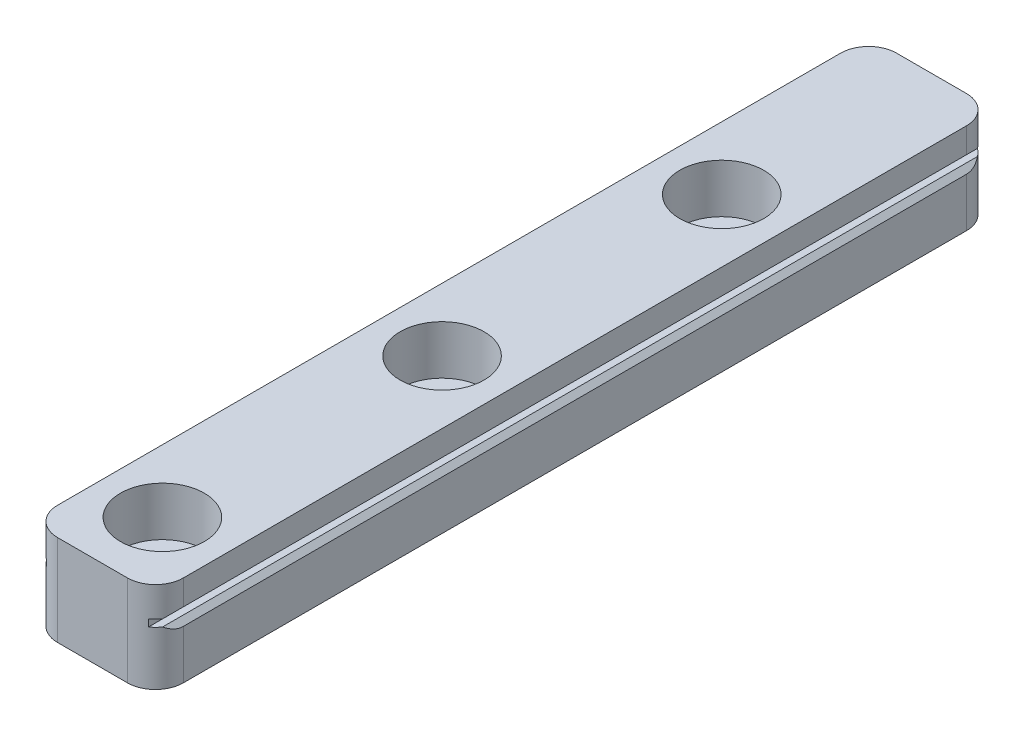
ISO-10303-21;
HEADER;
FILE_DESCRIPTION(('STEP AP214'),'2;1');
FILE_NAME('part.step','',(''),(''),'','','');
FILE_SCHEMA(('AUTOMOTIVE_DESIGN { 1 0 10303 214 1 1 1 1 }'));
ENDSEC;
DATA;
#1=APPLICATION_CONTEXT('core data for automotive mechanical design processes');
#2=APPLICATION_PROTOCOL_DEFINITION('international standard','automotive_design',2000,#1);
#3=PRODUCT_CONTEXT('',#1,'mechanical');
#4=PRODUCT('Part','Part','',(#3));
#5=PRODUCT_RELATED_PRODUCT_CATEGORY('part','',(#4));
#6=PRODUCT_DEFINITION_FORMATION('','',#4);
#7=PRODUCT_DEFINITION_CONTEXT('part definition',#1,'design');
#8=PRODUCT_DEFINITION('design','',#6,#7);
#9=PRODUCT_DEFINITION_SHAPE('','',#8);
#10=(LENGTH_UNIT() NAMED_UNIT(*) SI_UNIT(.MILLI.,.METRE.));
#11=(NAMED_UNIT(*) PLANE_ANGLE_UNIT() SI_UNIT($,.RADIAN.));
#12=(NAMED_UNIT(*) SI_UNIT($,.STERADIAN.) SOLID_ANGLE_UNIT());
#13=UNCERTAINTY_MEASURE_WITH_UNIT(LENGTH_MEASURE(1.E-05),#10,'distance_accuracy_value','');
#14=(GEOMETRIC_REPRESENTATION_CONTEXT(3) GLOBAL_UNCERTAINTY_ASSIGNED_CONTEXT((#13)) GLOBAL_UNIT_ASSIGNED_CONTEXT((#10,
#11,#12)) REPRESENTATION_CONTEXT('',''));
#15=CARTESIAN_POINT('',(0.,0.,0.));
#16=DIRECTION('',(0.,0.,1.));
#17=DIRECTION('',(1.,0.,0.));
#18=AXIS2_PLACEMENT_3D('',#15,#16,#17);
#19=CARTESIAN_POINT('',(0.,0.,-60.));
#20=DIRECTION('',(-1.,0.,0.));
#21=DIRECTION('',(0.,-1.,0.));
#22=AXIS2_PLACEMENT_3D('',#19,#20,#21);
#23=PLANE('',#22);
#24=DIRECTION('',(0.,0.,1.));
#25=VECTOR('',#24,1.);
#26=CARTESIAN_POINT('',(0.,3.5,-60.));
#27=LINE('',#26,#25);
#28=CARTESIAN_POINT('',(0.,3.5,-58.));
#29=VERTEX_POINT('',#28);
#30=CARTESIAN_POINT('',(0.,3.5,-2.));
#31=VERTEX_POINT('',#30);
#32=EDGE_CURVE('E204',#29,#31,#27,.T.);
#33=ORIENTED_EDGE('',*,*,#32,.F.);
#34=DIRECTION('',(0.,-1.,0.));
#35=VECTOR('',#34,1.);
#36=CARTESIAN_POINT('',(0.,0.,-58.));
#37=LINE('',#36,#35);
#38=CARTESIAN_POINT('',(0.,0.,-58.));
#39=VERTEX_POINT('',#38);
#40=EDGE_CURVE('E248',#29,#39,#37,.T.);
#41=ORIENTED_EDGE('',*,*,#40,.T.);
#42=DIRECTION('',(0.,0.,1.));
#43=VECTOR('',#42,1.);
#44=CARTESIAN_POINT('',(0.,0.,-60.));
#45=LINE('',#44,#43);
#46=CARTESIAN_POINT('',(0.,0.,-2.));
#47=VERTEX_POINT('',#46);
#48=EDGE_CURVE('E196',#39,#47,#45,.T.);
#49=ORIENTED_EDGE('',*,*,#48,.T.);
#50=DIRECTION('',(0.,-1.,0.));
#51=VECTOR('',#50,1.);
#52=CARTESIAN_POINT('',(0.,3.5,-2.));
#53=LINE('',#52,#51);
#54=EDGE_CURVE('E184',#47,#31,#53,.F.);
#55=ORIENTED_EDGE('',*,*,#54,.T.);
#56=EDGE_LOOP('',(#33,#41,#49,#55));
#57=FACE_BOUND('',#56,.T.);
#58=ADVANCED_FACE('F34',(#57),#23,.T.);
#59=CARTESIAN_POINT('',(0.,3.5,-60.));
#60=DIRECTION('',(-0.707106781186545,0.70710678118655,0.));
#61=DIRECTION('',(-0.70710678118655,-0.707106781186545,0.));
#62=AXIS2_PLACEMENT_3D('',#59,#60,#61);
#63=PLANE('',#62);
#64=DIRECTION('',(0.,0.,1.));
#65=VECTOR('',#64,1.);
#66=CARTESIAN_POINT('',(0.353553390593273,3.85355339059327,-60.));
#67=LINE('',#66,#65);
#68=CARTESIAN_POINT('',(0.353553390593273,3.85355339059327,-59.1354354065173));
#69=VERTEX_POINT('',#68);
#70=CARTESIAN_POINT('',(0.353553390593273,3.85355339059327,-0.864564593482705));
#71=VERTEX_POINT('',#70);
#72=EDGE_CURVE('E295',#69,#71,#67,.T.);
#73=ORIENTED_EDGE('',*,*,#72,.F.);
#74=CARTESIAN_POINT('',(2.,5.49999999999999,-58.));
#75=DIRECTION('',(-0.707106781186545,0.70710678118655,0.));
#76=DIRECTION('',(-0.70710678118655,-0.707106781186545,0.));
#77=AXIS2_PLACEMENT_3D('',#74,#75,#76);
#78=ELLIPSE('',#77,2.82842712474618,2.);
#79=EDGE_CURVE('E271',#69,#29,#78,.T.);
#80=ORIENTED_EDGE('',*,*,#79,.T.);
#81=ORIENTED_EDGE('',*,*,#32,.T.);
#82=CARTESIAN_POINT('',(2.,5.49999999999999,-2.));
#83=DIRECTION('',(-0.707106781186545,0.70710678118655,0.));
#84=DIRECTION('',(0.70710678118655,0.707106781186545,0.));
#85=AXIS2_PLACEMENT_3D('',#82,#83,#84);
#86=ELLIPSE('',#85,2.82842712474618,2.);
#87=EDGE_CURVE('E49',#31,#71,#86,.T.);
#88=ORIENTED_EDGE('',*,*,#87,.T.);
#89=EDGE_LOOP('',(#73,#80,#81,#88));
#90=FACE_BOUND('',#89,.T.);
#91=ADVANCED_FACE('F293',(#90),#63,.T.);
#92=CARTESIAN_POINT('',(0.353553390593273,3.85355339059327,-60.));
#93=DIRECTION('',(0.,1.,0.));
#94=DIRECTION('',(0.,0.,1.));
#95=AXIS2_PLACEMENT_3D('',#92,#93,#94);
#96=PLANE('',#95);
#97=DIRECTION('',(0.,0.,1.));
#98=VECTOR('',#97,1.);
#99=CARTESIAN_POINT('',(0.853553390593273,3.85355339059327,-60.));
#100=LINE('',#99,#98);
#101=CARTESIAN_POINT('',(0.853553390593273,3.85355339059327,-59.6387983926584));
#102=VERTEX_POINT('',#101);
#103=CARTESIAN_POINT('',(0.853553390593273,3.85355339059327,-0.361201607341578));
#104=VERTEX_POINT('',#103);
#105=EDGE_CURVE('E297',#102,#104,#100,.T.);
#106=ORIENTED_EDGE('',*,*,#105,.F.);
#107=CARTESIAN_POINT('',(2.,3.85355339059327,-58.));
#108=DIRECTION('',(0.,1.,0.));
#109=DIRECTION('',(0.,0.,1.));
#110=AXIS2_PLACEMENT_3D('',#107,#108,#109);
#111=CIRCLE('',#110,2.);
#112=EDGE_CURVE('E56',#102,#69,#111,.T.);
#113=ORIENTED_EDGE('',*,*,#112,.T.);
#114=ORIENTED_EDGE('',*,*,#72,.T.);
#115=CARTESIAN_POINT('',(2.,3.85355339059327,-2.));
#116=DIRECTION('',(0.,1.,0.));
#117=DIRECTION('',(0.,0.,1.));
#118=AXIS2_PLACEMENT_3D('',#115,#116,#117);
#119=CIRCLE('',#118,2.);
#120=EDGE_CURVE('E267',#71,#104,#119,.T.);
#121=ORIENTED_EDGE('',*,*,#120,.T.);
#122=EDGE_LOOP('',(#106,#113,#114,#121));
#123=FACE_BOUND('',#122,.T.);
#124=ADVANCED_FACE('F433',(#123),#96,.T.);
#125=CARTESIAN_POINT('',(0.853553390593273,3.85355339059327,-60.));
#126=DIRECTION('',(-1.,0.,0.));
#127=DIRECTION('',(0.,0.,1.));
#128=AXIS2_PLACEMENT_3D('',#125,#126,#127);
#129=PLANE('',#128);
#130=DIRECTION('',(0.,0.,1.));
#131=VECTOR('',#130,1.);
#132=CARTESIAN_POINT('',(0.853553390593273,4.35355339059327,-60.));
#133=LINE('',#132,#131);
#134=CARTESIAN_POINT('',(0.853553390593273,4.35355339059327,-59.6387983926584));
#135=VERTEX_POINT('',#134);
#136=CARTESIAN_POINT('',(0.853553390593273,4.35355339059327,-0.36120160734158));
#137=VERTEX_POINT('',#136);
#138=EDGE_CURVE('E303',#135,#137,#133,.T.);
#139=ORIENTED_EDGE('',*,*,#138,.F.);
#140=DIRECTION('',(0.,-1.,0.));
#141=VECTOR('',#140,1.);
#142=CARTESIAN_POINT('',(0.853553390593273,4.35355339059327,-59.6387983926584));
#143=LINE('',#142,#141);
#144=EDGE_CURVE('E265',#135,#102,#143,.T.);
#145=ORIENTED_EDGE('',*,*,#144,.T.);
#146=ORIENTED_EDGE('',*,*,#105,.T.);
#147=DIRECTION('',(0.,1.,0.));
#148=VECTOR('',#147,1.);
#149=CARTESIAN_POINT('',(0.853553390593273,3.85355339059327,-0.361201607341581));
#150=LINE('',#149,#148);
#151=EDGE_CURVE('E263',#104,#137,#150,.T.);
#152=ORIENTED_EDGE('',*,*,#151,.T.);
#153=EDGE_LOOP('',(#139,#145,#146,#152));
#154=FACE_BOUND('',#153,.T.);
#155=ADVANCED_FACE('F432',(#154),#129,.T.);
#156=CARTESIAN_POINT('',(0.853553390593273,4.35355339059327,-60.));
#157=DIRECTION('',(0.,-1.,0.));
#158=DIRECTION('',(0.,0.,-1.));
#159=AXIS2_PLACEMENT_3D('',#156,#157,#158);
#160=PLANE('',#159);
#161=DIRECTION('',(0.,0.,1.));
#162=VECTOR('',#161,1.);
#163=CARTESIAN_POINT('',(0.353553390593274,4.35355339059327,-60.));
#164=LINE('',#163,#162);
#165=CARTESIAN_POINT('',(0.353553390593274,4.35355339059327,-59.1354354065173));
#166=VERTEX_POINT('',#165);
#167=CARTESIAN_POINT('',(0.353553390593274,4.35355339059327,-0.86456459348272));
#168=VERTEX_POINT('',#167);
#169=EDGE_CURVE('E306',#166,#168,#164,.T.);
#170=ORIENTED_EDGE('',*,*,#169,.F.);
#171=CARTESIAN_POINT('',(2.,4.35355339059327,-58.));
#172=DIRECTION('',(0.,-1.,0.));
#173=DIRECTION('',(0.,0.,-1.));
#174=AXIS2_PLACEMENT_3D('',#171,#172,#173);
#175=CIRCLE('',#174,2.);
#176=EDGE_CURVE('E261',#166,#135,#175,.T.);
#177=ORIENTED_EDGE('',*,*,#176,.T.);
#178=ORIENTED_EDGE('',*,*,#138,.T.);
#179=CARTESIAN_POINT('',(2.,4.35355339059327,-2.));
#180=DIRECTION('',(0.,-1.,0.));
#181=DIRECTION('',(0.,0.,-1.));
#182=AXIS2_PLACEMENT_3D('',#179,#180,#181);
#183=CIRCLE('',#182,2.);
#184=EDGE_CURVE('E259',#137,#168,#183,.T.);
#185=ORIENTED_EDGE('',*,*,#184,.T.);
#186=EDGE_LOOP('',(#170,#177,#178,#185));
#187=FACE_BOUND('',#186,.T.);
#188=ADVANCED_FACE('F428',(#187),#160,.T.);
#189=CARTESIAN_POINT('',(0.353553390593274,4.35355339059327,-60.));
#190=DIRECTION('',(-0.707106781186547,-0.707106781186547,0.));
#191=DIRECTION('',(0.707106781186548,-0.707106781186548,0.));
#192=AXIS2_PLACEMENT_3D('',#189,#190,#191);
#193=PLANE('',#192);
#194=DIRECTION('',(0.,0.,1.));
#195=VECTOR('',#194,1.);
#196=CARTESIAN_POINT('',(0.,4.70710678118655,-60.));
#197=LINE('',#196,#195);
#198=CARTESIAN_POINT('',(0.,4.70710678118655,-58.));
#199=VERTEX_POINT('',#198);
#200=CARTESIAN_POINT('',(0.,4.70710678118655,-2.));
#201=VERTEX_POINT('',#200);
#202=EDGE_CURVE('E309',#199,#201,#197,.T.);
#203=ORIENTED_EDGE('',*,*,#202,.F.);
#204=CARTESIAN_POINT('',(2.,2.70710678118655,-58.));
#205=DIRECTION('',(-0.707106781186547,-0.707106781186547,0.));
#206=DIRECTION('',(0.707106781186548,-0.707106781186548,0.));
#207=AXIS2_PLACEMENT_3D('',#204,#205,#206);
#208=ELLIPSE('',#207,2.82842712474619,2.);
#209=EDGE_CURVE('E257',#199,#166,#208,.T.);
#210=ORIENTED_EDGE('',*,*,#209,.T.);
#211=ORIENTED_EDGE('',*,*,#169,.T.);
#212=CARTESIAN_POINT('',(2.,2.70710678118655,-2.));
#213=DIRECTION('',(-0.707106781186547,-0.707106781186547,0.));
#214=DIRECTION('',(-0.707106781186548,0.707106781186548,0.));
#215=AXIS2_PLACEMENT_3D('',#212,#213,#214);
#216=ELLIPSE('',#215,2.82842712474619,2.);
#217=EDGE_CURVE('E255',#168,#201,#216,.T.);
#218=ORIENTED_EDGE('',*,*,#217,.T.);
#219=EDGE_LOOP('',(#203,#210,#211,#218));
#220=FACE_BOUND('',#219,.T.);
#221=ADVANCED_FACE('F424',(#220),#193,.T.);
#222=CARTESIAN_POINT('',(0.,4.70710678118655,-60.));
#223=DIRECTION('',(-1.,0.,0.));
#224=DIRECTION('',(0.,0.,1.));
#225=AXIS2_PLACEMENT_3D('',#222,#223,#224);
#226=PLANE('',#225);
#227=DIRECTION('',(0.,0.,1.));
#228=VECTOR('',#227,1.);
#229=CARTESIAN_POINT('',(0.,6.5,-60.));
#230=LINE('',#229,#228);
#231=CARTESIAN_POINT('',(0.,6.5,-58.));
#232=VERTEX_POINT('',#231);
#233=CARTESIAN_POINT('',(0.,6.5,-2.));
#234=VERTEX_POINT('',#233);
#235=EDGE_CURVE('E312',#232,#234,#230,.T.);
#236=ORIENTED_EDGE('',*,*,#235,.F.);
#237=DIRECTION('',(0.,-1.,0.));
#238=VECTOR('',#237,1.);
#239=CARTESIAN_POINT('',(0.,5.60355339059327,-58.));
#240=LINE('',#239,#238);
#241=EDGE_CURVE('E253',#232,#199,#240,.T.);
#242=ORIENTED_EDGE('',*,*,#241,.T.);
#243=ORIENTED_EDGE('',*,*,#202,.T.);
#244=DIRECTION('',(0.,-1.,0.));
#245=VECTOR('',#244,1.);
#246=CARTESIAN_POINT('',(0.,6.5,-2.));
#247=LINE('',#246,#245);
#248=EDGE_CURVE('E251',#201,#234,#247,.F.);
#249=ORIENTED_EDGE('',*,*,#248,.T.);
#250=EDGE_LOOP('',(#236,#242,#243,#249));
#251=FACE_BOUND('',#250,.T.);
#252=ADVANCED_FACE('F398',(#251),#226,.T.);
#253=CARTESIAN_POINT('',(9.,6.5,-60.));
#254=DIRECTION('',(0.,1.,0.));
#255=DIRECTION('',(0.,0.,1.));
#256=AXIS2_PLACEMENT_3D('',#253,#254,#255);
#257=PLANE('',#256);
#258=CARTESIAN_POINT('',(4.5,6.5,-25.));
#259=DIRECTION('',(0.,1.,0.));
#260=DIRECTION('',(0.,0.,1.));
#261=AXIS2_PLACEMENT_3D('',#258,#259,#260);
#262=CIRCLE('',#261,3.);
#263=CARTESIAN_POINT('',(4.5,6.5,-22.));
#264=VERTEX_POINT('',#263);
#265=EDGE_CURVE('E353',#264,#264,#262,.T.);
#266=ORIENTED_EDGE('',*,*,#265,.F.);
#267=EDGE_LOOP('',(#266));
#268=FACE_BOUND('',#267,.T.);
#269=CARTESIAN_POINT('',(4.5,6.5,-45.));
#270=DIRECTION('',(0.,1.,0.));
#271=DIRECTION('',(0.,0.,1.));
#272=AXIS2_PLACEMENT_3D('',#269,#270,#271);
#273=CIRCLE('',#272,3.);
#274=CARTESIAN_POINT('',(4.5,6.5,-42.));
#275=VERTEX_POINT('',#274);
#276=EDGE_CURVE('E347',#275,#275,#273,.T.);
#277=ORIENTED_EDGE('',*,*,#276,.F.);
#278=EDGE_LOOP('',(#277));
#279=FACE_BOUND('',#278,.T.);
#280=CARTESIAN_POINT('',(4.5,6.5,-5.));
#281=DIRECTION('',(0.,1.,0.));
#282=DIRECTION('',(0.,0.,1.));
#283=AXIS2_PLACEMENT_3D('',#280,#281,#282);
#284=CIRCLE('',#283,3.);
#285=CARTESIAN_POINT('',(4.5,6.5,-2.));
#286=VERTEX_POINT('',#285);
#287=EDGE_CURVE('E341',#286,#286,#284,.T.);
#288=ORIENTED_EDGE('',*,*,#287,.F.);
#289=EDGE_LOOP('',(#288));
#290=FACE_BOUND('',#289,.T.);
#291=DIRECTION('',(0.,0.,1.));
#292=VECTOR('',#291,1.);
#293=CARTESIAN_POINT('',(9.,6.5,-60.));
#294=LINE('',#293,#292);
#295=CARTESIAN_POINT('',(9.,6.5,-58.));
#296=VERTEX_POINT('',#295);
#297=CARTESIAN_POINT('',(9.,6.5,-2.));
#298=VERTEX_POINT('',#297);
#299=EDGE_CURVE('E315',#296,#298,#294,.T.);
#300=ORIENTED_EDGE('',*,*,#299,.F.);
#301=CARTESIAN_POINT('',(7.,6.5,-58.));
#302=DIRECTION('',(0.,1.,0.));
#303=DIRECTION('',(0.,0.,1.));
#304=AXIS2_PLACEMENT_3D('',#301,#302,#303);
#305=CIRCLE('',#304,2.);
#306=CARTESIAN_POINT('',(7.,6.5,-60.));
#307=VERTEX_POINT('',#306);
#308=EDGE_CURVE('E236',#296,#307,#305,.T.);
#309=ORIENTED_EDGE('',*,*,#308,.T.);
#310=DIRECTION('',(-1.,0.,0.));
#311=VECTOR('',#310,1.);
#312=CARTESIAN_POINT('',(9.,6.5,-60.));
#313=LINE('',#312,#311);
#314=CARTESIAN_POINT('',(2.,6.5,-60.));
#315=VERTEX_POINT('',#314);
#316=EDGE_CURVE('E333',#307,#315,#313,.T.);
#317=ORIENTED_EDGE('',*,*,#316,.T.);
#318=CARTESIAN_POINT('',(2.,6.5,-58.));
#319=DIRECTION('',(0.,1.,0.));
#320=DIRECTION('',(0.,0.,1.));
#321=AXIS2_PLACEMENT_3D('',#318,#319,#320);
#322=CIRCLE('',#321,2.);
#323=EDGE_CURVE('E234',#315,#232,#322,.T.);
#324=ORIENTED_EDGE('',*,*,#323,.T.);
#325=ORIENTED_EDGE('',*,*,#235,.T.);
#326=CARTESIAN_POINT('',(2.,6.5,-2.));
#327=DIRECTION('',(0.,1.,0.));
#328=DIRECTION('',(0.,0.,1.));
#329=AXIS2_PLACEMENT_3D('',#326,#327,#328);
#330=CIRCLE('',#329,2.);
#331=CARTESIAN_POINT('',(2.,6.5,0.));
#332=VERTEX_POINT('',#331);
#333=EDGE_CURVE('E229',#234,#332,#330,.T.);
#334=ORIENTED_EDGE('',*,*,#333,.T.);
#335=DIRECTION('',(-1.,0.,0.));
#336=VECTOR('',#335,1.);
#337=CARTESIAN_POINT('',(9.,6.5,0.));
#338=LINE('',#337,#336);
#339=CARTESIAN_POINT('',(7.,6.5,0.));
#340=VERTEX_POINT('',#339);
#341=EDGE_CURVE('E280',#340,#332,#338,.T.);
#342=ORIENTED_EDGE('',*,*,#341,.F.);
#343=CARTESIAN_POINT('',(7.,6.5,-2.));
#344=DIRECTION('',(0.,1.,0.));
#345=DIRECTION('',(0.,0.,1.));
#346=AXIS2_PLACEMENT_3D('',#343,#344,#345);
#347=CIRCLE('',#346,2.);
#348=EDGE_CURVE('E232',#340,#298,#347,.T.);
#349=ORIENTED_EDGE('',*,*,#348,.T.);
#350=EDGE_LOOP('',(#300,#309,#317,#324,#325,#334,#342,#349));
#351=FACE_BOUND('',#350,.T.);
#352=ADVANCED_FACE('F394',(#268,#279,#290,#351),#257,.T.);
#353=CARTESIAN_POINT('',(9.,4.70710678118655,-60.));
#354=DIRECTION('',(1.,0.,0.));
#355=DIRECTION('',(0.,1.,0.));
#356=AXIS2_PLACEMENT_3D('',#353,#354,#355);
#357=PLANE('',#356);
#358=DIRECTION('',(0.,0.,1.));
#359=VECTOR('',#358,1.);
#360=CARTESIAN_POINT('',(9.,4.70710678118655,-60.));
#361=LINE('',#360,#359);
#362=CARTESIAN_POINT('',(9.,4.70710678118655,-58.));
#363=VERTEX_POINT('',#362);
#364=CARTESIAN_POINT('',(9.,4.70710678118655,-2.));
#365=VERTEX_POINT('',#364);
#366=EDGE_CURVE('E318',#363,#365,#361,.T.);
#367=ORIENTED_EDGE('',*,*,#366,.F.);
#368=DIRECTION('',(0.,1.,0.));
#369=VECTOR('',#368,1.);
#370=CARTESIAN_POINT('',(9.,5.60355339059327,-58.));
#371=LINE('',#370,#369);
#372=EDGE_CURVE('E227',#363,#296,#371,.T.);
#373=ORIENTED_EDGE('',*,*,#372,.T.);
#374=ORIENTED_EDGE('',*,*,#299,.T.);
#375=DIRECTION('',(0.,-1.,0.));
#376=VECTOR('',#375,1.);
#377=CARTESIAN_POINT('',(9.,5.60355339059327,-2.));
#378=LINE('',#377,#376);
#379=EDGE_CURVE('E225',#298,#365,#378,.T.);
#380=ORIENTED_EDGE('',*,*,#379,.T.);
#381=EDGE_LOOP('',(#367,#373,#374,#380));
#382=FACE_BOUND('',#381,.T.);
#383=ADVANCED_FACE('F397',(#382),#357,.T.);
#384=CARTESIAN_POINT('',(8.64644660940673,4.35355339059327,-60.));
#385=DIRECTION('',(0.707106781186547,-0.707106781186547,0.));
#386=DIRECTION('',(0.707106781186548,0.707106781186548,0.));
#387=AXIS2_PLACEMENT_3D('',#384,#385,#386);
#388=PLANE('',#387);
#389=DIRECTION('',(0.,0.,1.));
#390=VECTOR('',#389,1.);
#391=CARTESIAN_POINT('',(8.64644660940673,4.35355339059327,-60.));
#392=LINE('',#391,#390);
#393=CARTESIAN_POINT('',(8.64644660940673,4.35355339059327,-59.1354354065173));
#394=VERTEX_POINT('',#393);
#395=CARTESIAN_POINT('',(8.64644660940673,4.35355339059327,-0.864564593482702));
#396=VERTEX_POINT('',#395);
#397=EDGE_CURVE('E321',#394,#396,#392,.T.);
#398=ORIENTED_EDGE('',*,*,#397,.F.);
#399=CARTESIAN_POINT('',(7.,2.70710678118655,-58.));
#400=DIRECTION('',(0.707106781186547,-0.707106781186547,0.));
#401=DIRECTION('',(0.707106781186548,0.707106781186548,0.));
#402=AXIS2_PLACEMENT_3D('',#399,#400,#401);
#403=ELLIPSE('',#402,2.82842712474619,2.);
#404=EDGE_CURVE('E223',#394,#363,#403,.T.);
#405=ORIENTED_EDGE('',*,*,#404,.T.);
#406=ORIENTED_EDGE('',*,*,#366,.T.);
#407=CARTESIAN_POINT('',(7.,2.70710678118655,-2.));
#408=DIRECTION('',(0.707106781186547,-0.707106781186547,0.));
#409=DIRECTION('',(-0.707106781186548,-0.707106781186548,0.));
#410=AXIS2_PLACEMENT_3D('',#407,#408,#409);
#411=ELLIPSE('',#410,2.82842712474619,2.);
#412=EDGE_CURVE('E221',#365,#396,#411,.T.);
#413=ORIENTED_EDGE('',*,*,#412,.T.);
#414=EDGE_LOOP('',(#398,#405,#406,#413));
#415=FACE_BOUND('',#414,.T.);
#416=ADVANCED_FACE('F464',(#415),#388,.T.);
#417=CARTESIAN_POINT('',(8.14644660940673,4.35355339059327,-60.));
#418=DIRECTION('',(0.,-1.,0.));
#419=DIRECTION('',(0.,0.,-1.));
#420=AXIS2_PLACEMENT_3D('',#417,#418,#419);
#421=PLANE('',#420);
#422=DIRECTION('',(0.,0.,1.));
#423=VECTOR('',#422,1.);
#424=CARTESIAN_POINT('',(8.14644660940673,4.35355339059327,-60.));
#425=LINE('',#424,#423);
#426=CARTESIAN_POINT('',(8.14644660940673,4.35355339059327,-59.6387983926584));
#427=VERTEX_POINT('',#426);
#428=CARTESIAN_POINT('',(8.14644660940673,4.35355339059327,-0.361201607341578));
#429=VERTEX_POINT('',#428);
#430=EDGE_CURVE('E324',#427,#429,#425,.T.);
#431=ORIENTED_EDGE('',*,*,#430,.F.);
#432=CARTESIAN_POINT('',(7.,4.35355339059327,-58.));
#433=DIRECTION('',(0.,-1.,0.));
#434=DIRECTION('',(0.,0.,-1.));
#435=AXIS2_PLACEMENT_3D('',#432,#433,#434);
#436=CIRCLE('',#435,2.);
#437=EDGE_CURVE('E219',#427,#394,#436,.T.);
#438=ORIENTED_EDGE('',*,*,#437,.T.);
#439=ORIENTED_EDGE('',*,*,#397,.T.);
#440=CARTESIAN_POINT('',(7.,4.35355339059327,-2.));
#441=DIRECTION('',(0.,-1.,0.));
#442=DIRECTION('',(0.,0.,-1.));
#443=AXIS2_PLACEMENT_3D('',#440,#441,#442);
#444=CIRCLE('',#443,2.);
#445=EDGE_CURVE('E217',#396,#429,#444,.T.);
#446=ORIENTED_EDGE('',*,*,#445,.T.);
#447=EDGE_LOOP('',(#431,#438,#439,#446));
#448=FACE_BOUND('',#447,.T.);
#449=ADVANCED_FACE('F469',(#448),#421,.T.);
#450=CARTESIAN_POINT('',(8.14644660940673,3.85355339059327,-60.));
#451=DIRECTION('',(1.,0.,0.));
#452=DIRECTION('',(0.,0.,-1.));
#453=AXIS2_PLACEMENT_3D('',#450,#451,#452);
#454=PLANE('',#453);
#455=DIRECTION('',(0.,0.,1.));
#456=VECTOR('',#455,1.);
#457=CARTESIAN_POINT('',(8.14644660940673,3.85355339059327,-60.));
#458=LINE('',#457,#456);
#459=CARTESIAN_POINT('',(8.14644660940673,3.85355339059327,-59.6387983926584));
#460=VERTEX_POINT('',#459);
#461=CARTESIAN_POINT('',(8.14644660940673,3.85355339059327,-0.361201607341579));
#462=VERTEX_POINT('',#461);
#463=EDGE_CURVE('E327',#460,#462,#458,.T.);
#464=ORIENTED_EDGE('',*,*,#463,.F.);
#465=DIRECTION('',(0.,1.,0.));
#466=VECTOR('',#465,1.);
#467=CARTESIAN_POINT('',(8.14644660940673,3.85355339059327,-59.6387983926584));
#468=LINE('',#467,#466);
#469=EDGE_CURVE('E215',#460,#427,#468,.T.);
#470=ORIENTED_EDGE('',*,*,#469,.T.);
#471=ORIENTED_EDGE('',*,*,#430,.T.);
#472=DIRECTION('',(0.,-1.,0.));
#473=VECTOR('',#472,1.);
#474=CARTESIAN_POINT('',(8.14644660940673,4.35355339059327,-0.361201607341581));
#475=LINE('',#474,#473);
#476=EDGE_CURVE('E213',#429,#462,#475,.T.);
#477=ORIENTED_EDGE('',*,*,#476,.T.);
#478=EDGE_LOOP('',(#464,#470,#471,#477));
#479=FACE_BOUND('',#478,.T.);
#480=ADVANCED_FACE('F473',(#479),#454,.T.);
#481=CARTESIAN_POINT('',(8.64644660940673,3.85355339059327,-60.));
#482=DIRECTION('',(0.,1.,0.));
#483=DIRECTION('',(0.,0.,1.));
#484=AXIS2_PLACEMENT_3D('',#481,#482,#483);
#485=PLANE('',#484);
#486=DIRECTION('',(0.,0.,1.));
#487=VECTOR('',#486,1.);
#488=CARTESIAN_POINT('',(8.64644660940673,3.85355339059327,-60.));
#489=LINE('',#488,#487);
#490=CARTESIAN_POINT('',(8.64644660940673,3.85355339059327,-59.1354354065173));
#491=VERTEX_POINT('',#490);
#492=CARTESIAN_POINT('',(8.64644660940673,3.85355339059327,-0.864564593482706));
#493=VERTEX_POINT('',#492);
#494=EDGE_CURVE('E330',#491,#493,#489,.T.);
#495=ORIENTED_EDGE('',*,*,#494,.F.);
#496=CARTESIAN_POINT('',(7.,3.85355339059327,-58.));
#497=DIRECTION('',(0.,1.,0.));
#498=DIRECTION('',(0.,0.,1.));
#499=AXIS2_PLACEMENT_3D('',#496,#497,#498);
#500=CIRCLE('',#499,2.);
#501=EDGE_CURVE('E211',#491,#460,#500,.T.);
#502=ORIENTED_EDGE('',*,*,#501,.T.);
#503=ORIENTED_EDGE('',*,*,#463,.T.);
#504=CARTESIAN_POINT('',(7.,3.85355339059327,-2.));
#505=DIRECTION('',(0.,1.,0.));
#506=DIRECTION('',(0.,0.,1.));
#507=AXIS2_PLACEMENT_3D('',#504,#505,#506);
#508=CIRCLE('',#507,2.);
#509=EDGE_CURVE('E209',#462,#493,#508,.T.);
#510=ORIENTED_EDGE('',*,*,#509,.T.);
#511=EDGE_LOOP('',(#495,#502,#503,#510));
#512=FACE_BOUND('',#511,.T.);
#513=ADVANCED_FACE('F477',(#512),#485,.T.);
#514=CARTESIAN_POINT('',(9.,3.5,-60.));
#515=DIRECTION('',(0.707106781186545,0.70710678118655,0.));
#516=DIRECTION('',(-0.70710678118655,0.707106781186545,0.));
#517=AXIS2_PLACEMENT_3D('',#514,#515,#516);
#518=PLANE('',#517);
#519=DIRECTION('',(0.,0.,1.));
#520=VECTOR('',#519,1.);
#521=CARTESIAN_POINT('',(9.,3.5,-60.));
#522=LINE('',#521,#520);
#523=CARTESIAN_POINT('',(9.,3.5,-58.));
#524=VERTEX_POINT('',#523);
#525=CARTESIAN_POINT('',(9.,3.5,-2.));
#526=VERTEX_POINT('',#525);
#527=EDGE_CURVE('E195',#524,#526,#522,.T.);
#528=ORIENTED_EDGE('',*,*,#527,.F.);
#529=CARTESIAN_POINT('',(7.,5.49999999999999,-58.));
#530=DIRECTION('',(0.707106781186545,0.70710678118655,0.));
#531=DIRECTION('',(-0.70710678118655,0.707106781186545,0.));
#532=AXIS2_PLACEMENT_3D('',#529,#530,#531);
#533=ELLIPSE('',#532,2.82842712474618,2.);
#534=EDGE_CURVE('E200',#524,#491,#533,.T.);
#535=ORIENTED_EDGE('',*,*,#534,.T.);
#536=ORIENTED_EDGE('',*,*,#494,.T.);
#537=CARTESIAN_POINT('',(7.,5.49999999999999,-2.));
#538=DIRECTION('',(0.707106781186545,0.70710678118655,0.));
#539=DIRECTION('',(0.70710678118655,-0.707106781186545,0.));
#540=AXIS2_PLACEMENT_3D('',#537,#538,#539);
#541=ELLIPSE('',#540,2.82842712474618,2.);
#542=EDGE_CURVE('E201',#493,#526,#541,.T.);
#543=ORIENTED_EDGE('',*,*,#542,.T.);
#544=EDGE_LOOP('',(#528,#535,#536,#543));
#545=FACE_BOUND('',#544,.T.);
#546=ADVANCED_FACE('F479',(#545),#518,.T.);
#547=CARTESIAN_POINT('',(9.,0.,-60.));
#548=DIRECTION('',(1.,0.,0.));
#549=DIRECTION('',(0.,0.,-1.));
#550=AXIS2_PLACEMENT_3D('',#547,#548,#549);
#551=PLANE('',#550);
#552=DIRECTION('',(0.,0.,1.));
#553=VECTOR('',#552,1.);
#554=CARTESIAN_POINT('',(9.,0.,-60.));
#555=LINE('',#554,#553);
#556=CARTESIAN_POINT('',(9.,0.,-58.));
#557=VERTEX_POINT('',#556);
#558=CARTESIAN_POINT('',(9.,0.,-2.));
#559=VERTEX_POINT('',#558);
#560=EDGE_CURVE('E177',#557,#559,#555,.T.);
#561=ORIENTED_EDGE('',*,*,#560,.F.);
#562=DIRECTION('',(0.,1.,0.));
#563=VECTOR('',#562,1.);
#564=CARTESIAN_POINT('',(9.,0.,-58.));
#565=LINE('',#564,#563);
#566=EDGE_CURVE('E191',#557,#524,#565,.T.);
#567=ORIENTED_EDGE('',*,*,#566,.T.);
#568=ORIENTED_EDGE('',*,*,#527,.T.);
#569=DIRECTION('',(0.,1.,0.));
#570=VECTOR('',#569,1.);
#571=CARTESIAN_POINT('',(9.,0.,-2.));
#572=LINE('',#571,#570);
#573=EDGE_CURVE('E194',#526,#559,#572,.F.);
#574=ORIENTED_EDGE('',*,*,#573,.T.);
#575=EDGE_LOOP('',(#561,#567,#568,#574));
#576=FACE_BOUND('',#575,.T.);
#577=ADVANCED_FACE('F189',(#576),#551,.T.);
#578=CARTESIAN_POINT('',(0.,0.,-60.));
#579=DIRECTION('',(0.,-1.,0.));
#580=DIRECTION('',(0.,0.,-1.));
#581=AXIS2_PLACEMENT_3D('',#578,#579,#580);
#582=PLANE('',#581);
#583=CARTESIAN_POINT('',(4.5,0.,-25.));
#584=DIRECTION('',(0.,-1.,0.));
#585=DIRECTION('',(0.,0.,-1.));
#586=AXIS2_PLACEMENT_3D('',#583,#584,#585);
#587=CIRCLE('',#586,1.75);
#588=CARTESIAN_POINT('',(4.5,0.,-26.75));
#589=VERTEX_POINT('',#588);
#590=EDGE_CURVE('E370',#589,#589,#587,.F.);
#591=ORIENTED_EDGE('',*,*,#590,.T.);
#592=EDGE_LOOP('',(#591));
#593=FACE_BOUND('',#592,.T.);
#594=CARTESIAN_POINT('',(4.5,0.,-45.));
#595=DIRECTION('',(0.,-1.,0.));
#596=DIRECTION('',(0.,0.,-1.));
#597=AXIS2_PLACEMENT_3D('',#594,#595,#596);
#598=CIRCLE('',#597,1.75);
#599=CARTESIAN_POINT('',(4.5,0.,-46.75));
#600=VERTEX_POINT('',#599);
#601=EDGE_CURVE('E364',#600,#600,#598,.F.);
#602=ORIENTED_EDGE('',*,*,#601,.T.);
#603=EDGE_LOOP('',(#602));
#604=FACE_BOUND('',#603,.T.);
#605=CARTESIAN_POINT('',(4.5,0.,-5.));
#606=DIRECTION('',(0.,-1.,0.));
#607=DIRECTION('',(0.,0.,-1.));
#608=AXIS2_PLACEMENT_3D('',#605,#606,#607);
#609=CIRCLE('',#608,1.75);
#610=CARTESIAN_POINT('',(4.5,0.,-6.75));
#611=VERTEX_POINT('',#610);
#612=EDGE_CURVE('E356',#611,#611,#609,.F.);
#613=ORIENTED_EDGE('',*,*,#612,.T.);
#614=EDGE_LOOP('',(#613));
#615=FACE_BOUND('',#614,.T.);
#616=DIRECTION('',(1.,0.,0.));
#617=VECTOR('',#616,1.);
#618=CARTESIAN_POINT('',(0.,0.,-60.));
#619=LINE('',#618,#617);
#620=CARTESIAN_POINT('',(2.,0.,-60.));
#621=VERTEX_POINT('',#620);
#622=CARTESIAN_POINT('',(7.,0.,-60.));
#623=VERTEX_POINT('',#622);
#624=EDGE_CURVE('E180',#621,#623,#619,.T.);
#625=ORIENTED_EDGE('',*,*,#624,.T.);
#626=CARTESIAN_POINT('',(7.,0.,-58.));
#627=DIRECTION('',(0.,-1.,0.));
#628=DIRECTION('',(0.,0.,-1.));
#629=AXIS2_PLACEMENT_3D('',#626,#627,#628);
#630=CIRCLE('',#629,2.);
#631=EDGE_CURVE('E174',#623,#557,#630,.T.);
#632=ORIENTED_EDGE('',*,*,#631,.T.);
#633=ORIENTED_EDGE('',*,*,#560,.T.);
#634=CARTESIAN_POINT('',(7.,0.,-2.));
#635=DIRECTION('',(0.,-1.,0.));
#636=DIRECTION('',(0.,0.,-1.));
#637=AXIS2_PLACEMENT_3D('',#634,#635,#636);
#638=CIRCLE('',#637,2.);
#639=CARTESIAN_POINT('',(7.,0.,0.));
#640=VERTEX_POINT('',#639);
#641=EDGE_CURVE('E244',#559,#640,#638,.T.);
#642=ORIENTED_EDGE('',*,*,#641,.T.);
#643=DIRECTION('',(1.,0.,0.));
#644=VECTOR('',#643,1.);
#645=CARTESIAN_POINT('',(0.,0.,0.));
#646=LINE('',#645,#644);
#647=CARTESIAN_POINT('',(2.,0.,0.));
#648=VERTEX_POINT('',#647);
#649=EDGE_CURVE('E277',#648,#640,#646,.T.);
#650=ORIENTED_EDGE('',*,*,#649,.F.);
#651=CARTESIAN_POINT('',(2.,0.,-2.));
#652=DIRECTION('',(0.,-1.,0.));
#653=DIRECTION('',(0.,0.,-1.));
#654=AXIS2_PLACEMENT_3D('',#651,#652,#653);
#655=CIRCLE('',#654,2.);
#656=EDGE_CURVE('E242',#648,#47,#655,.T.);
#657=ORIENTED_EDGE('',*,*,#656,.T.);
#658=ORIENTED_EDGE('',*,*,#48,.F.);
#659=CARTESIAN_POINT('',(2.,0.,-58.));
#660=DIRECTION('',(0.,-1.,0.));
#661=DIRECTION('',(0.,0.,-1.));
#662=AXIS2_PLACEMENT_3D('',#659,#660,#661);
#663=CIRCLE('',#662,2.);
#664=EDGE_CURVE('E185',#39,#621,#663,.T.);
#665=ORIENTED_EDGE('',*,*,#664,.T.);
#666=EDGE_LOOP('',(#625,#632,#633,#642,#650,#657,#658,#665));
#667=FACE_BOUND('',#666,.T.);
#668=ADVANCED_FACE('F176',(#593,#604,#615,#667),#582,.T.);
#669=CARTESIAN_POINT('',(0.,0.,-60.));
#670=DIRECTION('',(0.,0.,-1.));
#671=DIRECTION('',(-1.,0.,0.));
#672=AXIS2_PLACEMENT_3D('',#669,#670,#671);
#673=PLANE('',#672);
#674=ORIENTED_EDGE('',*,*,#316,.F.);
#675=DIRECTION('',(0.,1.,0.));
#676=VECTOR('',#675,1.);
#677=CARTESIAN_POINT('',(7.,0.,-60.));
#678=LINE('',#677,#676);
#679=EDGE_CURVE('E240',#307,#623,#678,.F.);
#680=ORIENTED_EDGE('',*,*,#679,.T.);
#681=ORIENTED_EDGE('',*,*,#624,.F.);
#682=DIRECTION('',(0.,-1.,0.));
#683=VECTOR('',#682,1.);
#684=CARTESIAN_POINT('',(2.,0.,-60.));
#685=LINE('',#684,#683);
#686=EDGE_CURVE('E238',#621,#315,#685,.F.);
#687=ORIENTED_EDGE('',*,*,#686,.T.);
#688=EDGE_LOOP('',(#674,#680,#681,#687));
#689=FACE_BOUND('',#688,.T.);
#690=ADVANCED_FACE('F410',(#689),#673,.T.);
#691=CARTESIAN_POINT('',(0.,0.,0.));
#692=DIRECTION('',(0.,0.,-1.));
#693=DIRECTION('',(-1.,0.,0.));
#694=AXIS2_PLACEMENT_3D('',#691,#692,#693);
#695=PLANE('',#694);
#696=ORIENTED_EDGE('',*,*,#649,.T.);
#697=DIRECTION('',(0.,1.,0.));
#698=VECTOR('',#697,1.);
#699=CARTESIAN_POINT('',(7.,3.5,0.));
#700=LINE('',#699,#698);
#701=EDGE_CURVE('E11',#640,#340,#700,.T.);
#702=ORIENTED_EDGE('',*,*,#701,.T.);
#703=ORIENTED_EDGE('',*,*,#341,.T.);
#704=DIRECTION('',(0.,-1.,0.));
#705=VECTOR('',#704,1.);
#706=CARTESIAN_POINT('',(2.,0.,0.));
#707=LINE('',#706,#705);
#708=EDGE_CURVE('E42',#332,#648,#707,.T.);
#709=ORIENTED_EDGE('',*,*,#708,.T.);
#710=EDGE_LOOP('',(#696,#702,#703,#709));
#711=FACE_BOUND('',#710,.T.);
#712=ADVANCED_FACE('F276',(#711),#695,.F.);
#713=CARTESIAN_POINT('',(4.5,3.,-5.));
#714=DIRECTION('',(0.,1.,0.));
#715=DIRECTION('',(0.,0.,1.));
#716=AXIS2_PLACEMENT_3D('',#713,#714,#715);
#717=CYLINDRICAL_SURFACE('',#716,3.);
#718=CARTESIAN_POINT('',(4.5,3.,-5.));
#719=DIRECTION('',(0.,1.,0.));
#720=DIRECTION('',(0.,0.,1.));
#721=AXIS2_PLACEMENT_3D('',#718,#719,#720);
#722=CIRCLE('',#721,3.);
#723=CARTESIAN_POINT('',(4.5,3.,-2.));
#724=VERTEX_POINT('',#723);
#725=EDGE_CURVE('E286',#724,#724,#722,.T.);
#726=ORIENTED_EDGE('',*,*,#725,.F.);
#727=EDGE_LOOP('',(#726));
#728=FACE_BOUND('',#727,.T.);
#729=ORIENTED_EDGE('',*,*,#287,.T.);
#730=EDGE_LOOP('',(#729));
#731=FACE_BOUND('',#730,.T.);
#732=ADVANCED_FACE('F572',(#728,#731),#717,.F.);
#733=CARTESIAN_POINT('',(4.5,3.,-5.));
#734=DIRECTION('',(0.,1.,0.));
#735=DIRECTION('',(0.,0.,1.));
#736=AXIS2_PLACEMENT_3D('',#733,#734,#735);
#737=PLANE('',#736);
#738=CARTESIAN_POINT('',(4.5,3.,-5.));
#739=DIRECTION('',(0.,1.,0.));
#740=DIRECTION('',(0.,0.,1.));
#741=AXIS2_PLACEMENT_3D('',#738,#739,#740);
#742=CIRCLE('',#741,1.75);
#743=CARTESIAN_POINT('',(4.5,3.,-3.25));
#744=VERTEX_POINT('',#743);
#745=EDGE_CURVE('E361',#744,#744,#742,.T.);
#746=ORIENTED_EDGE('',*,*,#745,.F.);
#747=EDGE_LOOP('',(#746));
#748=FACE_BOUND('',#747,.T.);
#749=ORIENTED_EDGE('',*,*,#725,.T.);
#750=EDGE_LOOP('',(#749));
#751=FACE_BOUND('',#750,.T.);
#752=ADVANCED_FACE('F642',(#748,#751),#737,.T.);
#753=CARTESIAN_POINT('',(4.5,3.,-45.));
#754=DIRECTION('',(0.,1.,0.));
#755=DIRECTION('',(0.,0.,1.));
#756=AXIS2_PLACEMENT_3D('',#753,#754,#755);
#757=CYLINDRICAL_SURFACE('',#756,3.);
#758=CARTESIAN_POINT('',(4.5,3.,-45.));
#759=DIRECTION('',(0.,1.,0.));
#760=DIRECTION('',(0.,0.,1.));
#761=AXIS2_PLACEMENT_3D('',#758,#759,#760);
#762=CIRCLE('',#761,3.);
#763=CARTESIAN_POINT('',(4.5,3.,-42.));
#764=VERTEX_POINT('',#763);
#765=EDGE_CURVE('E344',#764,#764,#762,.T.);
#766=ORIENTED_EDGE('',*,*,#765,.F.);
#767=EDGE_LOOP('',(#766));
#768=FACE_BOUND('',#767,.T.);
#769=ORIENTED_EDGE('',*,*,#276,.T.);
#770=EDGE_LOOP('',(#769));
#771=FACE_BOUND('',#770,.T.);
#772=ADVANCED_FACE('F635',(#768,#771),#757,.F.);
#773=CARTESIAN_POINT('',(4.5,3.,-45.));
#774=DIRECTION('',(0.,1.,0.));
#775=DIRECTION('',(0.,0.,1.));
#776=AXIS2_PLACEMENT_3D('',#773,#774,#775);
#777=PLANE('',#776);
#778=CARTESIAN_POINT('',(4.5,3.,-45.));
#779=DIRECTION('',(0.,1.,0.));
#780=DIRECTION('',(0.,0.,1.));
#781=AXIS2_PLACEMENT_3D('',#778,#779,#780);
#782=CIRCLE('',#781,1.75);
#783=CARTESIAN_POINT('',(4.5,3.,-43.25));
#784=VERTEX_POINT('',#783);
#785=EDGE_CURVE('E367',#784,#784,#782,.T.);
#786=ORIENTED_EDGE('',*,*,#785,.F.);
#787=EDGE_LOOP('',(#786));
#788=FACE_BOUND('',#787,.T.);
#789=ORIENTED_EDGE('',*,*,#765,.T.);
#790=EDGE_LOOP('',(#789));
#791=FACE_BOUND('',#790,.T.);
#792=ADVANCED_FACE('F390',(#788,#791),#777,.T.);
#793=CARTESIAN_POINT('',(4.5,3.,-25.));
#794=DIRECTION('',(0.,1.,0.));
#795=DIRECTION('',(0.,0.,1.));
#796=AXIS2_PLACEMENT_3D('',#793,#794,#795);
#797=CYLINDRICAL_SURFACE('',#796,3.);
#798=CARTESIAN_POINT('',(4.5,3.,-25.));
#799=DIRECTION('',(0.,1.,0.));
#800=DIRECTION('',(0.,0.,1.));
#801=AXIS2_PLACEMENT_3D('',#798,#799,#800);
#802=CIRCLE('',#801,3.);
#803=CARTESIAN_POINT('',(4.5,3.,-22.));
#804=VERTEX_POINT('',#803);
#805=EDGE_CURVE('E350',#804,#804,#802,.T.);
#806=ORIENTED_EDGE('',*,*,#805,.F.);
#807=EDGE_LOOP('',(#806));
#808=FACE_BOUND('',#807,.T.);
#809=ORIENTED_EDGE('',*,*,#265,.T.);
#810=EDGE_LOOP('',(#809));
#811=FACE_BOUND('',#810,.T.);
#812=ADVANCED_FACE('F384',(#808,#811),#797,.F.);
#813=CARTESIAN_POINT('',(4.5,3.,-25.));
#814=DIRECTION('',(0.,1.,0.));
#815=DIRECTION('',(0.,0.,1.));
#816=AXIS2_PLACEMENT_3D('',#813,#814,#815);
#817=PLANE('',#816);
#818=CARTESIAN_POINT('',(4.5,3.,-25.));
#819=DIRECTION('',(0.,1.,0.));
#820=DIRECTION('',(0.,0.,1.));
#821=AXIS2_PLACEMENT_3D('',#818,#819,#820);
#822=CIRCLE('',#821,1.75);
#823=CARTESIAN_POINT('',(4.5,3.,-23.25));
#824=VERTEX_POINT('',#823);
#825=EDGE_CURVE('E373',#824,#824,#822,.T.);
#826=ORIENTED_EDGE('',*,*,#825,.F.);
#827=EDGE_LOOP('',(#826));
#828=FACE_BOUND('',#827,.T.);
#829=ORIENTED_EDGE('',*,*,#805,.T.);
#830=EDGE_LOOP('',(#829));
#831=FACE_BOUND('',#830,.T.);
#832=ADVANCED_FACE('F380',(#828,#831),#817,.T.);
#833=CARTESIAN_POINT('',(4.5,-4.94974746830584,-5.));
#834=DIRECTION('',(0.,1.,0.));
#835=DIRECTION('',(0.,0.,1.));
#836=AXIS2_PLACEMENT_3D('',#833,#834,#835);
#837=CYLINDRICAL_SURFACE('',#836,1.75);
#838=ORIENTED_EDGE('',*,*,#745,.T.);
#839=EDGE_LOOP('',(#838));
#840=FACE_BOUND('',#839,.T.);
#841=ORIENTED_EDGE('',*,*,#612,.F.);
#842=EDGE_LOOP('',(#841));
#843=FACE_BOUND('',#842,.T.);
#844=ADVANCED_FACE('F383',(#840,#843),#837,.F.);
#845=CARTESIAN_POINT('',(4.5,-4.94974746830584,-45.));
#846=DIRECTION('',(0.,1.,0.));
#847=DIRECTION('',(0.,0.,1.));
#848=AXIS2_PLACEMENT_3D('',#845,#846,#847);
#849=CYLINDRICAL_SURFACE('',#848,1.75);
#850=ORIENTED_EDGE('',*,*,#785,.T.);
#851=EDGE_LOOP('',(#850));
#852=FACE_BOUND('',#851,.T.);
#853=ORIENTED_EDGE('',*,*,#601,.F.);
#854=EDGE_LOOP('',(#853));
#855=FACE_BOUND('',#854,.T.);
#856=ADVANCED_FACE('F605',(#852,#855),#849,.F.);
#857=CARTESIAN_POINT('',(4.5,-4.94974746830584,-25.));
#858=DIRECTION('',(0.,1.,0.));
#859=DIRECTION('',(0.,0.,1.));
#860=AXIS2_PLACEMENT_3D('',#857,#858,#859);
#861=CYLINDRICAL_SURFACE('',#860,1.75);
#862=ORIENTED_EDGE('',*,*,#825,.T.);
#863=EDGE_LOOP('',(#862));
#864=FACE_BOUND('',#863,.T.);
#865=ORIENTED_EDGE('',*,*,#590,.F.);
#866=EDGE_LOOP('',(#865));
#867=FACE_BOUND('',#866,.T.);
#868=ADVANCED_FACE('F377',(#864,#867),#861,.F.);
#869=CARTESIAN_POINT('',(7.,0.,-58.));
#870=DIRECTION('',(0.,1.,0.));
#871=DIRECTION('',(0.,0.,1.));
#872=AXIS2_PLACEMENT_3D('',#869,#870,#871);
#873=CYLINDRICAL_SURFACE('',#872,2.);
#874=ORIENTED_EDGE('',*,*,#631,.F.);
#875=ORIENTED_EDGE('',*,*,#679,.F.);
#876=ORIENTED_EDGE('',*,*,#308,.F.);
#877=ORIENTED_EDGE('',*,*,#372,.F.);
#878=ORIENTED_EDGE('',*,*,#404,.F.);
#879=ORIENTED_EDGE('',*,*,#437,.F.);
#880=ORIENTED_EDGE('',*,*,#469,.F.);
#881=ORIENTED_EDGE('',*,*,#501,.F.);
#882=ORIENTED_EDGE('',*,*,#534,.F.);
#883=ORIENTED_EDGE('',*,*,#566,.F.);
#884=EDGE_LOOP('',(#874,#875,#876,#877,#878,#879,#880,#881,#882,#883));
#885=FACE_BOUND('',#884,.T.);
#886=ADVANCED_FACE('F198',(#885),#873,.T.);
#887=CARTESIAN_POINT('',(2.,0.,-58.));
#888=DIRECTION('',(0.,-1.,0.));
#889=DIRECTION('',(1.,0.,0.));
#890=AXIS2_PLACEMENT_3D('',#887,#888,#889);
#891=CYLINDRICAL_SURFACE('',#890,2.);
#892=ORIENTED_EDGE('',*,*,#323,.F.);
#893=ORIENTED_EDGE('',*,*,#686,.F.);
#894=ORIENTED_EDGE('',*,*,#664,.F.);
#895=ORIENTED_EDGE('',*,*,#40,.F.);
#896=ORIENTED_EDGE('',*,*,#79,.F.);
#897=ORIENTED_EDGE('',*,*,#112,.F.);
#898=ORIENTED_EDGE('',*,*,#144,.F.);
#899=ORIENTED_EDGE('',*,*,#176,.F.);
#900=ORIENTED_EDGE('',*,*,#209,.F.);
#901=ORIENTED_EDGE('',*,*,#241,.F.);
#902=EDGE_LOOP('',(#892,#893,#894,#895,#896,#897,#898,#899,#900,#901));
#903=FACE_BOUND('',#902,.T.);
#904=ADVANCED_FACE('F413',(#903),#891,.T.);
#905=CARTESIAN_POINT('',(7.,0.,-2.));
#906=DIRECTION('',(0.,-1.,0.));
#907=DIRECTION('',(0.,0.,-1.));
#908=AXIS2_PLACEMENT_3D('',#905,#906,#907);
#909=CYLINDRICAL_SURFACE('',#908,2.);
#910=ORIENTED_EDGE('',*,*,#641,.F.);
#911=ORIENTED_EDGE('',*,*,#573,.F.);
#912=ORIENTED_EDGE('',*,*,#542,.F.);
#913=ORIENTED_EDGE('',*,*,#509,.F.);
#914=ORIENTED_EDGE('',*,*,#476,.F.);
#915=ORIENTED_EDGE('',*,*,#445,.F.);
#916=ORIENTED_EDGE('',*,*,#412,.F.);
#917=ORIENTED_EDGE('',*,*,#379,.F.);
#918=ORIENTED_EDGE('',*,*,#348,.F.);
#919=ORIENTED_EDGE('',*,*,#701,.F.);
#920=EDGE_LOOP('',(#910,#911,#912,#913,#914,#915,#916,#917,#918,#919));
#921=FACE_BOUND('',#920,.T.);
#922=ADVANCED_FACE('F452',(#921),#909,.T.);
#923=CARTESIAN_POINT('',(2.,0.,-2.));
#924=DIRECTION('',(0.,1.,0.));
#925=DIRECTION('',(-1.,0.,0.));
#926=AXIS2_PLACEMENT_3D('',#923,#924,#925);
#927=CYLINDRICAL_SURFACE('',#926,2.);
#928=ORIENTED_EDGE('',*,*,#656,.F.);
#929=ORIENTED_EDGE('',*,*,#708,.F.);
#930=ORIENTED_EDGE('',*,*,#333,.F.);
#931=ORIENTED_EDGE('',*,*,#248,.F.);
#932=ORIENTED_EDGE('',*,*,#217,.F.);
#933=ORIENTED_EDGE('',*,*,#184,.F.);
#934=ORIENTED_EDGE('',*,*,#151,.F.);
#935=ORIENTED_EDGE('',*,*,#120,.F.);
#936=ORIENTED_EDGE('',*,*,#87,.F.);
#937=ORIENTED_EDGE('',*,*,#54,.F.);
#938=EDGE_LOOP('',(#928,#929,#930,#931,#932,#933,#934,#935,#936,#937));
#939=FACE_BOUND('',#938,.T.);
#940=ADVANCED_FACE('F36',(#939),#927,.T.);
#941=CLOSED_SHELL('',(#58,#91,#124,#155,#188,#221,#252,#352,#383,#416,#449,#480,#513,#546,#577,
#668,#690,#712,#732,#752,#772,#792,#812,#832,#844,#856,#868,#886,#904,#922,#940));
#942=MANIFOLD_SOLID_BREP('B2',#941);
#943=ADVANCED_BREP_SHAPE_REPRESENTATION('',(#18,#942),#14);
#944=SHAPE_DEFINITION_REPRESENTATION(#9,#943);
ENDSEC;
END-ISO-10303-21;
